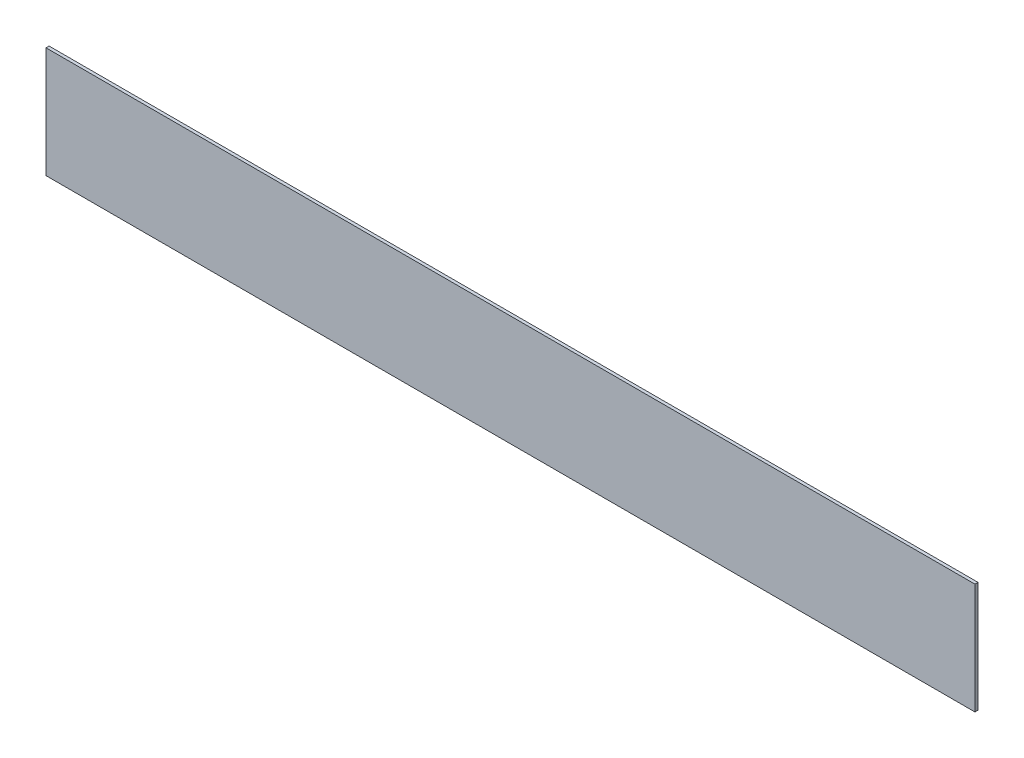
ISO-10303-21;
HEADER;
FILE_DESCRIPTION(('STEP AP214'),'2;1');
FILE_NAME('part.step','',(''),(''),'','','');
FILE_SCHEMA(('AUTOMOTIVE_DESIGN { 1 0 10303 214 1 1 1 1 }'));
ENDSEC;
DATA;
#1=APPLICATION_CONTEXT('core data for automotive mechanical design processes');
#2=APPLICATION_PROTOCOL_DEFINITION('international standard','automotive_design',2000,#1);
#3=PRODUCT_CONTEXT('',#1,'mechanical');
#4=PRODUCT('Part','Part','',(#3));
#5=PRODUCT_RELATED_PRODUCT_CATEGORY('part','',(#4));
#6=PRODUCT_DEFINITION_FORMATION('','',#4);
#7=PRODUCT_DEFINITION_CONTEXT('part definition',#1,'design');
#8=PRODUCT_DEFINITION('design','',#6,#7);
#9=PRODUCT_DEFINITION_SHAPE('','',#8);
#10=(LENGTH_UNIT() NAMED_UNIT(*) SI_UNIT(.MILLI.,.METRE.));
#11=(NAMED_UNIT(*) PLANE_ANGLE_UNIT() SI_UNIT($,.RADIAN.));
#12=(NAMED_UNIT(*) SI_UNIT($,.STERADIAN.) SOLID_ANGLE_UNIT());
#13=UNCERTAINTY_MEASURE_WITH_UNIT(LENGTH_MEASURE(1.E-05),#10,'distance_accuracy_value','');
#14=(GEOMETRIC_REPRESENTATION_CONTEXT(3) GLOBAL_UNCERTAINTY_ASSIGNED_CONTEXT((#13)) GLOBAL_UNIT_ASSIGNED_CONTEXT((#10,
#11,#12)) REPRESENTATION_CONTEXT('',''));
#15=CARTESIAN_POINT('',(0.,0.,0.));
#16=DIRECTION('',(0.,0.,1.));
#17=DIRECTION('',(1.,0.,0.));
#18=AXIS2_PLACEMENT_3D('',#15,#16,#17);
#19=CARTESIAN_POINT('',(158.,32.,27.));
#20=DIRECTION('',(1.,0.,0.));
#21=DIRECTION('',(0.,0.,-1.));
#22=AXIS2_PLACEMENT_3D('',#19,#20,#21);
#23=PLANE('',#22);
#24=DIRECTION('',(0.,-1.,0.));
#25=VECTOR('',#24,1.);
#26=CARTESIAN_POINT('',(158.,32.,26.));
#27=LINE('',#26,#25);
#28=CARTESIAN_POINT('',(158.,68.,26.));
#29=VERTEX_POINT('',#28);
#30=CARTESIAN_POINT('',(158.,32.,26.));
#31=VERTEX_POINT('',#30);
#32=EDGE_CURVE('E102',#29,#31,#27,.T.);
#33=ORIENTED_EDGE('',*,*,#32,.T.);
#34=DIRECTION('',(0.,0.,-1.));
#35=VECTOR('',#34,1.);
#36=CARTESIAN_POINT('',(158.,32.,27.));
#37=LINE('',#36,#35);
#38=CARTESIAN_POINT('',(158.,32.,27.));
#39=VERTEX_POINT('',#38);
#40=EDGE_CURVE('E11',#39,#31,#37,.T.);
#41=ORIENTED_EDGE('',*,*,#40,.F.);
#42=DIRECTION('',(0.,-1.,0.));
#43=VECTOR('',#42,1.);
#44=CARTESIAN_POINT('',(158.,32.,27.));
#45=LINE('',#44,#43);
#46=CARTESIAN_POINT('',(158.,68.,27.));
#47=VERTEX_POINT('',#46);
#48=EDGE_CURVE('E90',#47,#39,#45,.T.);
#49=ORIENTED_EDGE('',*,*,#48,.F.);
#50=DIRECTION('',(0.,0.,-1.));
#51=VECTOR('',#50,1.);
#52=CARTESIAN_POINT('',(158.,68.,27.));
#53=LINE('',#52,#51);
#54=EDGE_CURVE('E98',#47,#29,#53,.T.);
#55=ORIENTED_EDGE('',*,*,#54,.T.);
#56=EDGE_LOOP('',(#33,#41,#49,#55));
#57=FACE_BOUND('',#56,.T.);
#58=ADVANCED_FACE('F39',(#57),#23,.F.);
#59=CARTESIAN_POINT('',(158.,32.,27.));
#60=DIRECTION('',(0.,1.,0.));
#61=DIRECTION('',(0.,0.,1.));
#62=AXIS2_PLACEMENT_3D('',#59,#60,#61);
#63=PLANE('',#62);
#64=DIRECTION('',(1.,0.,0.));
#65=VECTOR('',#64,1.);
#66=CARTESIAN_POINT('',(158.,32.,26.));
#67=LINE('',#66,#65);
#68=CARTESIAN_POINT('',(460.,32.,26.));
#69=VERTEX_POINT('',#68);
#70=EDGE_CURVE('E94',#31,#69,#67,.T.);
#71=ORIENTED_EDGE('',*,*,#70,.T.);
#72=DIRECTION('',(0.,0.,-1.));
#73=VECTOR('',#72,1.);
#74=CARTESIAN_POINT('',(460.,32.,27.));
#75=LINE('',#74,#73);
#76=CARTESIAN_POINT('',(460.,32.,27.));
#77=VERTEX_POINT('',#76);
#78=EDGE_CURVE('E47',#77,#69,#75,.T.);
#79=ORIENTED_EDGE('',*,*,#78,.F.);
#80=DIRECTION('',(1.,0.,0.));
#81=VECTOR('',#80,1.);
#82=CARTESIAN_POINT('',(158.,32.,27.));
#83=LINE('',#82,#81);
#84=EDGE_CURVE('E85',#39,#77,#83,.T.);
#85=ORIENTED_EDGE('',*,*,#84,.F.);
#86=ORIENTED_EDGE('',*,*,#40,.T.);
#87=EDGE_LOOP('',(#71,#79,#85,#86));
#88=FACE_BOUND('',#87,.T.);
#89=ADVANCED_FACE('F93',(#88),#63,.F.);
#90=CARTESIAN_POINT('',(460.,32.,27.));
#91=DIRECTION('',(-1.,0.,0.));
#92=DIRECTION('',(0.,0.,1.));
#93=AXIS2_PLACEMENT_3D('',#90,#91,#92);
#94=PLANE('',#93);
#95=DIRECTION('',(0.,1.,0.));
#96=VECTOR('',#95,1.);
#97=CARTESIAN_POINT('',(460.,32.,26.));
#98=LINE('',#97,#96);
#99=CARTESIAN_POINT('',(460.,68.,26.));
#100=VERTEX_POINT('',#99);
#101=EDGE_CURVE('E72',#69,#100,#98,.T.);
#102=ORIENTED_EDGE('',*,*,#101,.T.);
#103=DIRECTION('',(0.,0.,-1.));
#104=VECTOR('',#103,1.);
#105=CARTESIAN_POINT('',(460.,68.,27.));
#106=LINE('',#105,#104);
#107=CARTESIAN_POINT('',(460.,68.,27.));
#108=VERTEX_POINT('',#107);
#109=EDGE_CURVE('E95',#108,#100,#106,.T.);
#110=ORIENTED_EDGE('',*,*,#109,.F.);
#111=DIRECTION('',(0.,1.,0.));
#112=VECTOR('',#111,1.);
#113=CARTESIAN_POINT('',(460.,32.,27.));
#114=LINE('',#113,#112);
#115=EDGE_CURVE('E88',#77,#108,#114,.T.);
#116=ORIENTED_EDGE('',*,*,#115,.F.);
#117=ORIENTED_EDGE('',*,*,#78,.T.);
#118=EDGE_LOOP('',(#102,#110,#116,#117));
#119=FACE_BOUND('',#118,.T.);
#120=ADVANCED_FACE('F96',(#119),#94,.F.);
#121=CARTESIAN_POINT('',(158.,68.,27.));
#122=DIRECTION('',(0.,-1.,0.));
#123=DIRECTION('',(0.,0.,-1.));
#124=AXIS2_PLACEMENT_3D('',#121,#122,#123);
#125=PLANE('',#124);
#126=DIRECTION('',(-1.,0.,0.));
#127=VECTOR('',#126,1.);
#128=CARTESIAN_POINT('',(158.,68.,26.));
#129=LINE('',#128,#127);
#130=EDGE_CURVE('E78',#100,#29,#129,.T.);
#131=ORIENTED_EDGE('',*,*,#130,.T.);
#132=ORIENTED_EDGE('',*,*,#54,.F.);
#133=DIRECTION('',(-1.,0.,0.));
#134=VECTOR('',#133,1.);
#135=CARTESIAN_POINT('',(158.,68.,27.));
#136=LINE('',#135,#134);
#137=EDGE_CURVE('E55',#108,#47,#136,.T.);
#138=ORIENTED_EDGE('',*,*,#137,.F.);
#139=ORIENTED_EDGE('',*,*,#109,.T.);
#140=EDGE_LOOP('',(#131,#132,#138,#139));
#141=FACE_BOUND('',#140,.T.);
#142=ADVANCED_FACE('F109',(#141),#125,.F.);
#143=CARTESIAN_POINT('',(0.,0.,27.));
#144=DIRECTION('',(0.,0.,-1.));
#145=DIRECTION('',(-1.,0.,0.));
#146=AXIS2_PLACEMENT_3D('',#143,#144,#145);
#147=PLANE('',#146);
#148=ORIENTED_EDGE('',*,*,#48,.T.);
#149=ORIENTED_EDGE('',*,*,#84,.T.);
#150=ORIENTED_EDGE('',*,*,#115,.T.);
#151=ORIENTED_EDGE('',*,*,#137,.T.);
#152=EDGE_LOOP('',(#148,#149,#150,#151));
#153=FACE_BOUND('',#152,.T.);
#154=ADVANCED_FACE('F86',(#153),#147,.F.);
#155=CARTESIAN_POINT('',(0.,0.,26.));
#156=DIRECTION('',(0.,0.,-1.));
#157=DIRECTION('',(-1.,0.,0.));
#158=AXIS2_PLACEMENT_3D('',#155,#156,#157);
#159=PLANE('',#158);
#160=ORIENTED_EDGE('',*,*,#32,.F.);
#161=ORIENTED_EDGE('',*,*,#130,.F.);
#162=ORIENTED_EDGE('',*,*,#101,.F.);
#163=ORIENTED_EDGE('',*,*,#70,.F.);
#164=EDGE_LOOP('',(#160,#161,#162,#163));
#165=FACE_BOUND('',#164,.T.);
#166=ADVANCED_FACE('F112',(#165),#159,.T.);
#167=CLOSED_SHELL('',(#58,#89,#120,#142,#154,#166));
#168=MANIFOLD_SOLID_BREP('B2',#167);
#169=ADVANCED_BREP_SHAPE_REPRESENTATION('',(#18,#168),#14);
#170=SHAPE_DEFINITION_REPRESENTATION(#9,#169);
ENDSEC;
END-ISO-10303-21;
